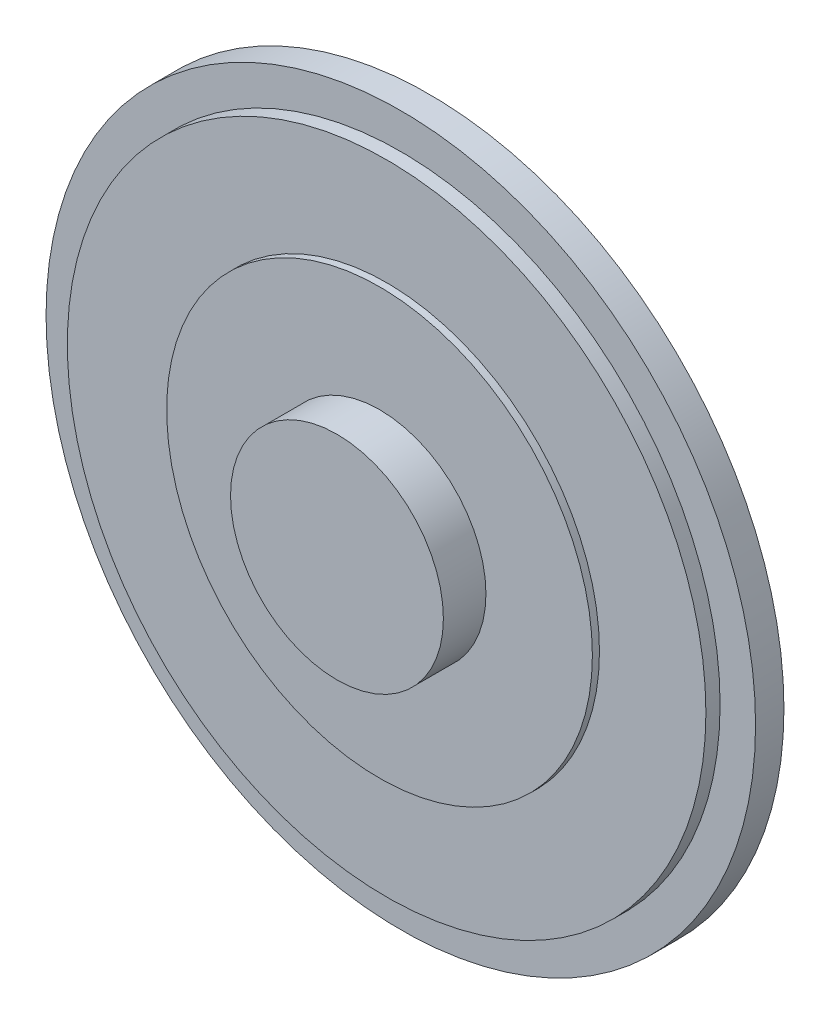
ISO-10303-21;
HEADER;
FILE_DESCRIPTION(('STEP AP214'),'2;1');
FILE_NAME('part.step','',(''),(''),'','','');
FILE_SCHEMA(('AUTOMOTIVE_DESIGN { 1 0 10303 214 1 1 1 1 }'));
ENDSEC;
DATA;
#1=APPLICATION_CONTEXT('core data for automotive mechanical design processes');
#2=APPLICATION_PROTOCOL_DEFINITION('international standard','automotive_design',2000,#1);
#3=PRODUCT_CONTEXT('',#1,'mechanical');
#4=PRODUCT('Part','Part','',(#3));
#5=PRODUCT_RELATED_PRODUCT_CATEGORY('part','',(#4));
#6=PRODUCT_DEFINITION_FORMATION('','',#4);
#7=PRODUCT_DEFINITION_CONTEXT('part definition',#1,'design');
#8=PRODUCT_DEFINITION('design','',#6,#7);
#9=PRODUCT_DEFINITION_SHAPE('','',#8);
#10=(LENGTH_UNIT() NAMED_UNIT(*) SI_UNIT(.MILLI.,.METRE.));
#11=(NAMED_UNIT(*) PLANE_ANGLE_UNIT() SI_UNIT($,.RADIAN.));
#12=(NAMED_UNIT(*) SI_UNIT($,.STERADIAN.) SOLID_ANGLE_UNIT());
#13=UNCERTAINTY_MEASURE_WITH_UNIT(LENGTH_MEASURE(1.E-05),#10,'distance_accuracy_value','');
#14=(GEOMETRIC_REPRESENTATION_CONTEXT(3) GLOBAL_UNCERTAINTY_ASSIGNED_CONTEXT((#13)) GLOBAL_UNIT_ASSIGNED_CONTEXT((#10,
#11,#12)) REPRESENTATION_CONTEXT('',''));
#15=CARTESIAN_POINT('',(0.,0.,0.));
#16=DIRECTION('',(0.,0.,1.));
#17=DIRECTION('',(1.,0.,0.));
#18=AXIS2_PLACEMENT_3D('',#15,#16,#17);
#19=CARTESIAN_POINT('',(0.,0.,2.));
#20=DIRECTION('',(0.,0.,-1.));
#21=DIRECTION('',(-1.,0.,0.));
#22=AXIS2_PLACEMENT_3D('',#19,#20,#21);
#23=CYLINDRICAL_SURFACE('',#22,25.);
#24=CARTESIAN_POINT('',(0.,0.,2.));
#25=DIRECTION('',(0.,0.,1.));
#26=DIRECTION('',(1.,0.,0.));
#27=AXIS2_PLACEMENT_3D('',#24,#25,#26);
#28=CIRCLE('',#27,25.);
#29=CARTESIAN_POINT('',(25.,0.,2.));
#30=VERTEX_POINT('',#29);
#31=EDGE_CURVE('E59',#30,#30,#28,.T.);
#32=ORIENTED_EDGE('',*,*,#31,.F.);
#33=EDGE_LOOP('',(#32));
#34=FACE_BOUND('',#33,.T.);
#35=CARTESIAN_POINT('',(0.,0.,0.));
#36=DIRECTION('',(0.,0.,1.));
#37=DIRECTION('',(1.,0.,0.));
#38=AXIS2_PLACEMENT_3D('',#35,#36,#37);
#39=CIRCLE('',#38,25.);
#40=CARTESIAN_POINT('',(25.,0.,0.));
#41=VERTEX_POINT('',#40);
#42=EDGE_CURVE('E38',#41,#41,#39,.T.);
#43=ORIENTED_EDGE('',*,*,#42,.T.);
#44=EDGE_LOOP('',(#43));
#45=FACE_BOUND('',#44,.T.);
#46=ADVANCED_FACE('F35',(#34,#45),#23,.T.);
#47=CARTESIAN_POINT('',(0.,0.,2.));
#48=DIRECTION('',(0.,0.,1.));
#49=DIRECTION('',(1.,0.,0.));
#50=AXIS2_PLACEMENT_3D('',#47,#48,#49);
#51=PLANE('',#50);
#52=CARTESIAN_POINT('',(0.,0.,2.));
#53=DIRECTION('',(0.,0.,1.));
#54=DIRECTION('',(1.,0.,0.));
#55=AXIS2_PLACEMENT_3D('',#52,#53,#54);
#56=CIRCLE('',#55,22.5);
#57=CARTESIAN_POINT('',(22.5,0.,2.));
#58=VERTEX_POINT('',#57);
#59=EDGE_CURVE('E47',#58,#58,#56,.T.);
#60=ORIENTED_EDGE('',*,*,#59,.F.);
#61=EDGE_LOOP('',(#60));
#62=FACE_BOUND('',#61,.T.);
#63=ORIENTED_EDGE('',*,*,#31,.T.);
#64=EDGE_LOOP('',(#63));
#65=FACE_BOUND('',#64,.T.);
#66=ADVANCED_FACE('F70',(#62,#65),#51,.T.);
#67=CARTESIAN_POINT('',(0.,0.,0.));
#68=DIRECTION('',(0.,0.,1.));
#69=DIRECTION('',(1.,0.,0.));
#70=AXIS2_PLACEMENT_3D('',#67,#68,#69);
#71=PLANE('',#70);
#72=ORIENTED_EDGE('',*,*,#42,.F.);
#73=EDGE_LOOP('',(#72));
#74=FACE_BOUND('',#73,.T.);
#75=ADVANCED_FACE('F67',(#74),#71,.F.);
#76=CARTESIAN_POINT('',(0.,0.,3.));
#77=DIRECTION('',(0.,0.,-1.));
#78=DIRECTION('',(-1.,0.,0.));
#79=AXIS2_PLACEMENT_3D('',#76,#77,#78);
#80=CYLINDRICAL_SURFACE('',#79,22.5);
#81=CARTESIAN_POINT('',(0.,0.,3.));
#82=DIRECTION('',(0.,0.,1.));
#83=DIRECTION('',(1.,0.,0.));
#84=AXIS2_PLACEMENT_3D('',#81,#82,#83);
#85=CIRCLE('',#84,22.5);
#86=CARTESIAN_POINT('',(22.5,0.,3.));
#87=VERTEX_POINT('',#86);
#88=EDGE_CURVE('E54',#87,#87,#85,.T.);
#89=ORIENTED_EDGE('',*,*,#88,.F.);
#90=EDGE_LOOP('',(#89));
#91=FACE_BOUND('',#90,.T.);
#92=ORIENTED_EDGE('',*,*,#59,.T.);
#93=EDGE_LOOP('',(#92));
#94=FACE_BOUND('',#93,.T.);
#95=ADVANCED_FACE('F69',(#91,#94),#80,.T.);
#96=CARTESIAN_POINT('',(0.,0.,3.));
#97=DIRECTION('',(0.,0.,1.));
#98=DIRECTION('',(1.,0.,0.));
#99=AXIS2_PLACEMENT_3D('',#96,#97,#98);
#100=PLANE('',#99);
#101=CARTESIAN_POINT('',(0.,0.,3.));
#102=DIRECTION('',(0.,0.,1.));
#103=DIRECTION('',(1.,0.,0.));
#104=AXIS2_PLACEMENT_3D('',#101,#102,#103);
#105=CIRCLE('',#104,15.);
#106=CARTESIAN_POINT('',(15.,0.,3.));
#107=VERTEX_POINT('',#106);
#108=EDGE_CURVE('E42',#107,#107,#105,.T.);
#109=ORIENTED_EDGE('',*,*,#108,.F.);
#110=EDGE_LOOP('',(#109));
#111=FACE_BOUND('',#110,.T.);
#112=ORIENTED_EDGE('',*,*,#88,.T.);
#113=EDGE_LOOP('',(#112));
#114=FACE_BOUND('',#113,.T.);
#115=ADVANCED_FACE('F75',(#111,#114),#100,.T.);
#116=CARTESIAN_POINT('',(0.,0.,3.5));
#117=DIRECTION('',(0.,0.,-1.));
#118=DIRECTION('',(-1.,0.,0.));
#119=AXIS2_PLACEMENT_3D('',#116,#117,#118);
#120=CYLINDRICAL_SURFACE('',#119,15.);
#121=CARTESIAN_POINT('',(0.,0.,3.5));
#122=DIRECTION('',(0.,0.,1.));
#123=DIRECTION('',(1.,0.,0.));
#124=AXIS2_PLACEMENT_3D('',#121,#122,#123);
#125=CIRCLE('',#124,15.);
#126=CARTESIAN_POINT('',(15.,0.,3.5));
#127=VERTEX_POINT('',#126);
#128=EDGE_CURVE('E52',#127,#127,#125,.T.);
#129=ORIENTED_EDGE('',*,*,#128,.F.);
#130=EDGE_LOOP('',(#129));
#131=FACE_BOUND('',#130,.T.);
#132=ORIENTED_EDGE('',*,*,#108,.T.);
#133=EDGE_LOOP('',(#132));
#134=FACE_BOUND('',#133,.T.);
#135=ADVANCED_FACE('F106',(#131,#134),#120,.T.);
#136=CARTESIAN_POINT('',(0.,0.,3.5));
#137=DIRECTION('',(0.,0.,1.));
#138=DIRECTION('',(1.,0.,0.));
#139=AXIS2_PLACEMENT_3D('',#136,#137,#138);
#140=PLANE('',#139);
#141=CARTESIAN_POINT('',(0.,0.,3.5));
#142=DIRECTION('',(0.,0.,1.));
#143=DIRECTION('',(1.,0.,0.));
#144=AXIS2_PLACEMENT_3D('',#141,#142,#143);
#145=CIRCLE('',#144,7.5);
#146=CARTESIAN_POINT('',(7.5,0.,3.5));
#147=VERTEX_POINT('',#146);
#148=EDGE_CURVE('E10',#147,#147,#145,.T.);
#149=ORIENTED_EDGE('',*,*,#148,.F.);
#150=EDGE_LOOP('',(#149));
#151=FACE_BOUND('',#150,.T.);
#152=ORIENTED_EDGE('',*,*,#128,.T.);
#153=EDGE_LOOP('',(#152));
#154=FACE_BOUND('',#153,.T.);
#155=ADVANCED_FACE('F116',(#151,#154),#140,.T.);
#156=CARTESIAN_POINT('',(0.,0.,6.5));
#157=DIRECTION('',(0.,0.,-1.));
#158=DIRECTION('',(-1.,0.,0.));
#159=AXIS2_PLACEMENT_3D('',#156,#157,#158);
#160=CYLINDRICAL_SURFACE('',#159,7.5);
#161=CARTESIAN_POINT('',(0.,0.,6.5));
#162=DIRECTION('',(0.,0.,1.));
#163=DIRECTION('',(1.,0.,0.));
#164=AXIS2_PLACEMENT_3D('',#161,#162,#163);
#165=CIRCLE('',#164,7.5);
#166=CARTESIAN_POINT('',(7.5,0.,6.5));
#167=VERTEX_POINT('',#166);
#168=EDGE_CURVE('E51',#167,#167,#165,.T.);
#169=ORIENTED_EDGE('',*,*,#168,.F.);
#170=EDGE_LOOP('',(#169));
#171=FACE_BOUND('',#170,.T.);
#172=ORIENTED_EDGE('',*,*,#148,.T.);
#173=EDGE_LOOP('',(#172));
#174=FACE_BOUND('',#173,.T.);
#175=ADVANCED_FACE('F126',(#171,#174),#160,.T.);
#176=CARTESIAN_POINT('',(0.,0.,6.5));
#177=DIRECTION('',(0.,0.,1.));
#178=DIRECTION('',(1.,0.,0.));
#179=AXIS2_PLACEMENT_3D('',#176,#177,#178);
#180=PLANE('',#179);
#181=ORIENTED_EDGE('',*,*,#168,.T.);
#182=EDGE_LOOP('',(#181));
#183=FACE_BOUND('',#182,.T.);
#184=ADVANCED_FACE('F136',(#183),#180,.T.);
#185=CLOSED_SHELL('',(#46,#66,#75,#95,#115,#135,#155,#175,#184));
#186=MANIFOLD_SOLID_BREP('B2',#185);
#187=ADVANCED_BREP_SHAPE_REPRESENTATION('',(#18,#186),#14);
#188=SHAPE_DEFINITION_REPRESENTATION(#9,#187);
ENDSEC;
END-ISO-10303-21;
